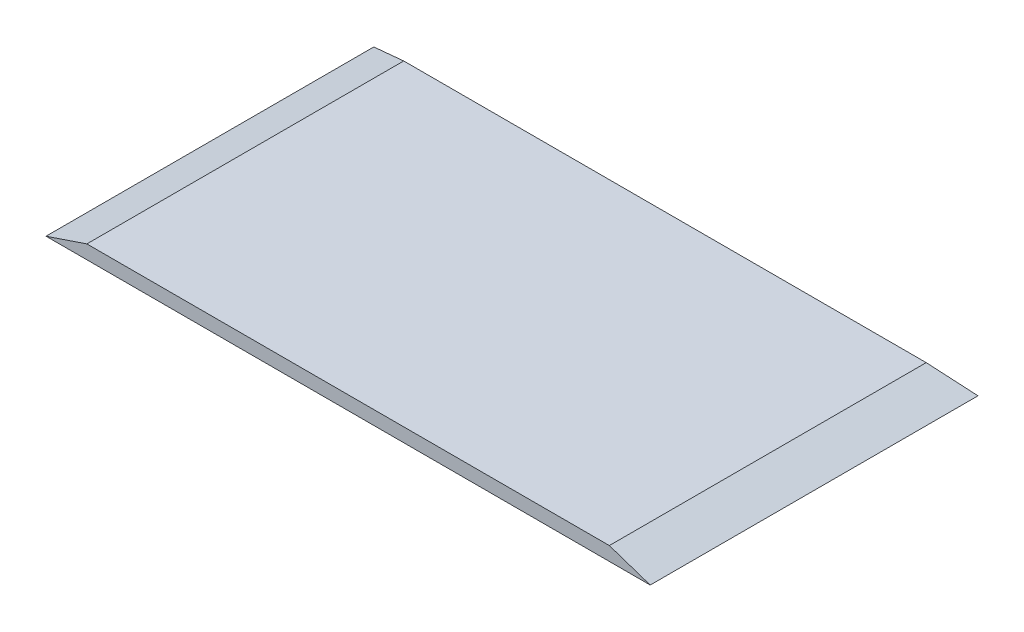
ISO-10303-21;
HEADER;
FILE_DESCRIPTION(('STEP AP214'),'2;1');
FILE_NAME('part.step','',(''),(''),'','','');
FILE_SCHEMA(('AUTOMOTIVE_DESIGN { 1 0 10303 214 1 1 1 1 }'));
ENDSEC;
DATA;
#1=APPLICATION_CONTEXT('core data for automotive mechanical design processes');
#2=APPLICATION_PROTOCOL_DEFINITION('international standard','automotive_design',2000,#1);
#3=PRODUCT_CONTEXT('',#1,'mechanical');
#4=PRODUCT('Part','Part','',(#3));
#5=PRODUCT_RELATED_PRODUCT_CATEGORY('part','',(#4));
#6=PRODUCT_DEFINITION_FORMATION('','',#4);
#7=PRODUCT_DEFINITION_CONTEXT('part definition',#1,'design');
#8=PRODUCT_DEFINITION('design','',#6,#7);
#9=PRODUCT_DEFINITION_SHAPE('','',#8);
#10=(LENGTH_UNIT() NAMED_UNIT(*) SI_UNIT(.MILLI.,.METRE.));
#11=(NAMED_UNIT(*) PLANE_ANGLE_UNIT() SI_UNIT($,.RADIAN.));
#12=(NAMED_UNIT(*) SI_UNIT($,.STERADIAN.) SOLID_ANGLE_UNIT());
#13=UNCERTAINTY_MEASURE_WITH_UNIT(LENGTH_MEASURE(1.E-05),#10,'distance_accuracy_value','');
#14=(GEOMETRIC_REPRESENTATION_CONTEXT(3) GLOBAL_UNCERTAINTY_ASSIGNED_CONTEXT((#13)) GLOBAL_UNIT_ASSIGNED_CONTEXT((#10,
#11,#12)) REPRESENTATION_CONTEXT('',''));
#15=CARTESIAN_POINT('',(0.,0.,0.));
#16=DIRECTION('',(0.,0.,1.));
#17=DIRECTION('',(1.,0.,0.));
#18=AXIS2_PLACEMENT_3D('',#15,#16,#17);
#19=CARTESIAN_POINT('',(0.,1.26,0.));
#20=DIRECTION('',(0.,0.,-1.));
#21=DIRECTION('',(-1.,0.,0.));
#22=AXIS2_PLACEMENT_3D('',#19,#20,#21);
#23=PLANE('',#22);
#24=DIRECTION('',(-0.94766487992284,0.319266777728016,0.));
#25=VECTOR('',#24,1.);
#26=CARTESIAN_POINT('',(5.6367995274539,16.7314525656171,0.));
#27=LINE('',#26,#25);
#28=CARTESIAN_POINT('',(55.3,0.,0.));
#29=VERTEX_POINT('',#28);
#30=CARTESIAN_POINT('',(51.56,1.26,0.));
#31=VERTEX_POINT('',#30);
#32=EDGE_CURVE('E71',#29,#31,#27,.T.);
#33=ORIENTED_EDGE('',*,*,#32,.T.);
#34=DIRECTION('',(1.,0.,0.));
#35=VECTOR('',#34,1.);
#36=CARTESIAN_POINT('',(0.,1.26,0.));
#37=LINE('',#36,#35);
#38=CARTESIAN_POINT('',(3.74,1.26,0.));
#39=VERTEX_POINT('',#38);
#40=EDGE_CURVE('E92',#39,#31,#37,.T.);
#41=ORIENTED_EDGE('',*,*,#40,.F.);
#42=DIRECTION('',(0.94766487992284,0.319266777728016,0.));
#43=VECTOR('',#42,1.);
#44=CARTESIAN_POINT('',(0.,0.,0.));
#45=LINE('',#44,#43);
#46=CARTESIAN_POINT('',(0.,0.,0.));
#47=VERTEX_POINT('',#46);
#48=EDGE_CURVE('E82',#47,#39,#45,.T.);
#49=ORIENTED_EDGE('',*,*,#48,.F.);
#50=DIRECTION('',(1.,0.,0.));
#51=VECTOR('',#50,1.);
#52=CARTESIAN_POINT('',(0.,0.,0.));
#53=LINE('',#52,#51);
#54=EDGE_CURVE('E81',#47,#29,#53,.T.);
#55=ORIENTED_EDGE('',*,*,#54,.T.);
#56=EDGE_LOOP('',(#33,#41,#49,#55));
#57=FACE_BOUND('',#56,.T.);
#58=ADVANCED_FACE('F32',(#57),#23,.F.);
#59=CARTESIAN_POINT('',(0.,1.26,0.));
#60=DIRECTION('',(0.,-1.,0.));
#61=DIRECTION('',(0.,0.,-1.));
#62=AXIS2_PLACEMENT_3D('',#59,#60,#61);
#63=PLANE('',#62);
#64=DIRECTION('',(0.,0.,1.));
#65=VECTOR('',#64,1.);
#66=CARTESIAN_POINT('',(51.56,1.26,-30.));
#67=LINE('',#66,#65);
#68=CARTESIAN_POINT('',(51.56,1.26,-29.));
#69=VERTEX_POINT('',#68);
#70=EDGE_CURVE('E74',#69,#31,#67,.T.);
#71=ORIENTED_EDGE('',*,*,#70,.F.);
#72=DIRECTION('',(-1.,0.,0.));
#73=VECTOR('',#72,1.);
#74=CARTESIAN_POINT('',(55.3,1.26,-29.));
#75=LINE('',#74,#73);
#76=CARTESIAN_POINT('',(3.74000000000001,1.26,-29.));
#77=VERTEX_POINT('',#76);
#78=EDGE_CURVE('E46',#69,#77,#75,.T.);
#79=ORIENTED_EDGE('',*,*,#78,.T.);
#80=DIRECTION('',(0.,0.,1.));
#81=VECTOR('',#80,1.);
#82=CARTESIAN_POINT('',(3.74,1.26,-30.));
#83=LINE('',#82,#81);
#84=EDGE_CURVE('E101',#77,#39,#83,.T.);
#85=ORIENTED_EDGE('',*,*,#84,.T.);
#86=ORIENTED_EDGE('',*,*,#40,.T.);
#87=EDGE_LOOP('',(#71,#79,#85,#86));
#88=FACE_BOUND('',#87,.T.);
#89=ADVANCED_FACE('F106',(#88),#63,.F.);
#90=CARTESIAN_POINT('',(55.3,0.,-30.));
#91=DIRECTION('',(0.,-0.62165785956401,0.783288903050652));
#92=DIRECTION('',(0.,-0.783288903050652,-0.62165785956401));
#93=AXIS2_PLACEMENT_3D('',#90,#91,#92);
#94=PLANE('',#93);
#95=DIRECTION('',(-0.918633361709563,0.309486105816591,0.245623893505231));
#96=VECTOR('',#95,1.);
#97=CARTESIAN_POINT('',(55.3,0.,-30.));
#98=LINE('',#97,#96);
#99=CARTESIAN_POINT('',(55.3,0.,-30.));
#100=VERTEX_POINT('',#99);
#101=EDGE_CURVE('E11',#100,#69,#98,.T.);
#102=ORIENTED_EDGE('',*,*,#101,.F.);
#103=DIRECTION('',(-1.,0.,0.));
#104=VECTOR('',#103,1.);
#105=CARTESIAN_POINT('',(0.,0.,-30.));
#106=LINE('',#105,#104);
#107=CARTESIAN_POINT('',(0.,0.,-30.));
#108=VERTEX_POINT('',#107);
#109=EDGE_CURVE('E90',#100,#108,#106,.T.);
#110=ORIENTED_EDGE('',*,*,#109,.T.);
#111=DIRECTION('',(0.918633361709563,0.309486105816591,0.245623893505231));
#112=VECTOR('',#111,1.);
#113=CARTESIAN_POINT('',(46.6669651044934,15.7220256769149,-17.5222018437183));
#114=LINE('',#113,#112);
#115=EDGE_CURVE('E39',#108,#77,#114,.T.);
#116=ORIENTED_EDGE('',*,*,#115,.T.);
#117=ORIENTED_EDGE('',*,*,#78,.F.);
#118=EDGE_LOOP('',(#102,#110,#116,#117));
#119=FACE_BOUND('',#118,.T.);
#120=ADVANCED_FACE('F105',(#119),#94,.F.);
#121=CARTESIAN_POINT('',(0.,0.,0.));
#122=DIRECTION('',(0.,-1.,0.));
#123=DIRECTION('',(0.,0.,-1.));
#124=AXIS2_PLACEMENT_3D('',#121,#122,#123);
#125=PLANE('',#124);
#126=DIRECTION('',(0.,0.,1.));
#127=VECTOR('',#126,1.);
#128=CARTESIAN_POINT('',(0.,0.,0.));
#129=LINE('',#128,#127);
#130=EDGE_CURVE('E85',#108,#47,#129,.T.);
#131=ORIENTED_EDGE('',*,*,#130,.F.);
#132=ORIENTED_EDGE('',*,*,#109,.F.);
#133=DIRECTION('',(0.,0.,-1.));
#134=VECTOR('',#133,1.);
#135=CARTESIAN_POINT('',(55.3,0.,0.));
#136=LINE('',#135,#134);
#137=EDGE_CURVE('E53',#29,#100,#136,.T.);
#138=ORIENTED_EDGE('',*,*,#137,.F.);
#139=ORIENTED_EDGE('',*,*,#54,.F.);
#140=EDGE_LOOP('',(#131,#132,#138,#139));
#141=FACE_BOUND('',#140,.T.);
#142=ADVANCED_FACE('F88',(#141),#125,.T.);
#143=CARTESIAN_POINT('',(0.,0.,-30.));
#144=DIRECTION('',(0.319266777728016,-0.947664879922839,0.));
#145=DIRECTION('',(0.94766487992284,0.319266777728016,0.));
#146=AXIS2_PLACEMENT_3D('',#143,#144,#145);
#147=PLANE('',#146);
#148=ORIENTED_EDGE('',*,*,#130,.T.);
#149=ORIENTED_EDGE('',*,*,#48,.T.);
#150=ORIENTED_EDGE('',*,*,#84,.F.);
#151=ORIENTED_EDGE('',*,*,#115,.F.);
#152=EDGE_LOOP('',(#148,#149,#150,#151));
#153=FACE_BOUND('',#152,.T.);
#154=ADVANCED_FACE('F104',(#153),#147,.F.);
#155=CARTESIAN_POINT('',(5.6367995274539,16.7314525656171,-30.));
#156=DIRECTION('',(0.319266777728016,0.947664879922839,0.));
#157=DIRECTION('',(-0.94766487992284,0.319266777728016,0.));
#158=AXIS2_PLACEMENT_3D('',#155,#156,#157);
#159=PLANE('',#158);
#160=ORIENTED_EDGE('',*,*,#101,.T.);
#161=ORIENTED_EDGE('',*,*,#70,.T.);
#162=ORIENTED_EDGE('',*,*,#32,.F.);
#163=ORIENTED_EDGE('',*,*,#137,.T.);
#164=EDGE_LOOP('',(#160,#161,#162,#163));
#165=FACE_BOUND('',#164,.T.);
#166=ADVANCED_FACE('F73',(#165),#159,.T.);
#167=CLOSED_SHELL('',(#58,#89,#120,#142,#154,#166));
#168=MANIFOLD_SOLID_BREP('B2',#167);
#169=ADVANCED_BREP_SHAPE_REPRESENTATION('',(#18,#168),#14);
#170=SHAPE_DEFINITION_REPRESENTATION(#9,#169);
ENDSEC;
END-ISO-10303-21;
